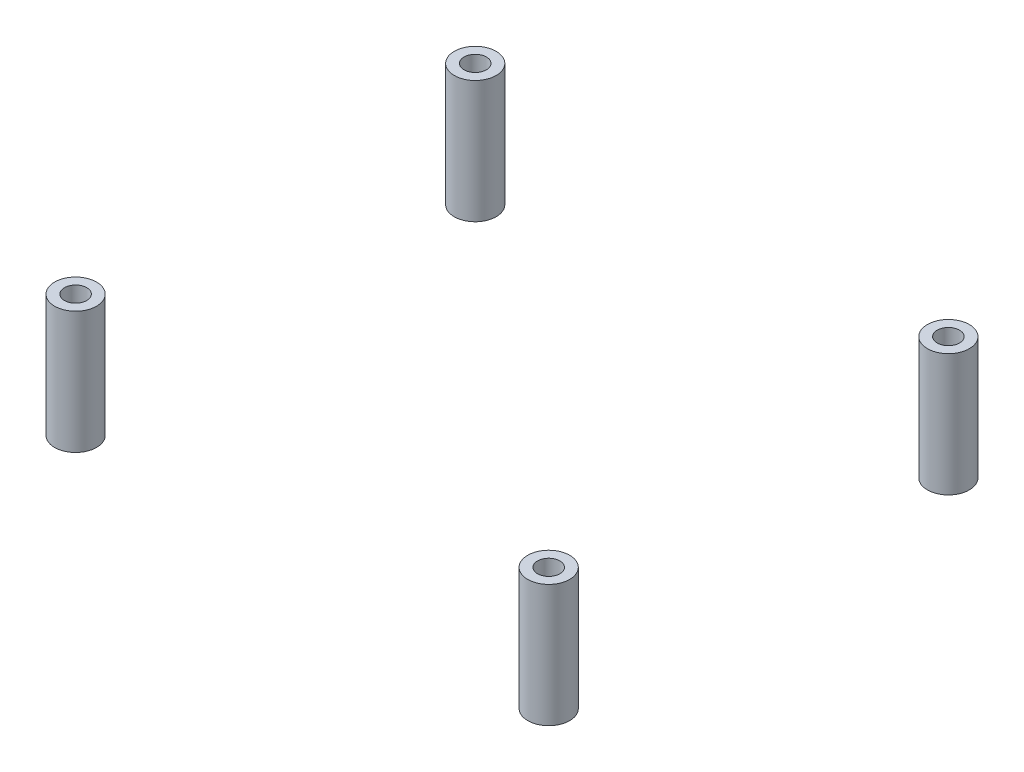
ISO-10303-21;
HEADER;
FILE_DESCRIPTION(('STEP AP214'),'2;1');
FILE_NAME('part.step','',(''),(''),'','','');
FILE_SCHEMA(('AUTOMOTIVE_DESIGN { 1 0 10303 214 1 1 1 1 }'));
ENDSEC;
DATA;
#1=APPLICATION_CONTEXT('core data for automotive mechanical design processes');
#2=APPLICATION_PROTOCOL_DEFINITION('international standard','automotive_design',2000,#1);
#3=PRODUCT_CONTEXT('',#1,'mechanical');
#4=PRODUCT('Part','Part','',(#3));
#5=PRODUCT_RELATED_PRODUCT_CATEGORY('part','',(#4));
#6=PRODUCT_DEFINITION_FORMATION('','',#4);
#7=PRODUCT_DEFINITION_CONTEXT('part definition',#1,'design');
#8=PRODUCT_DEFINITION('design','',#6,#7);
#9=PRODUCT_DEFINITION_SHAPE('','',#8);
#10=(LENGTH_UNIT() NAMED_UNIT(*) SI_UNIT(.MILLI.,.METRE.));
#11=(NAMED_UNIT(*) PLANE_ANGLE_UNIT() SI_UNIT($,.RADIAN.));
#12=(NAMED_UNIT(*) SI_UNIT($,.STERADIAN.) SOLID_ANGLE_UNIT());
#13=UNCERTAINTY_MEASURE_WITH_UNIT(LENGTH_MEASURE(1.E-05),#10,'distance_accuracy_value','');
#14=(GEOMETRIC_REPRESENTATION_CONTEXT(3) GLOBAL_UNCERTAINTY_ASSIGNED_CONTEXT((#13)) GLOBAL_UNIT_ASSIGNED_CONTEXT((#10,
#11,#12)) REPRESENTATION_CONTEXT('',''));
#15=CARTESIAN_POINT('',(0.,0.,0.));
#16=DIRECTION('',(0.,0.,1.));
#17=DIRECTION('',(1.,0.,0.));
#18=AXIS2_PLACEMENT_3D('',#15,#16,#17);
#19=CARTESIAN_POINT('',(128.455,15.,-54.4602623042089));
#20=DIRECTION('',(0.,1.,0.));
#21=DIRECTION('',(0.,0.,1.));
#22=AXIS2_PLACEMENT_3D('',#19,#20,#21);
#23=PLANE('',#22);
#24=CARTESIAN_POINT('',(128.455,15.,-54.4602623042089));
#25=DIRECTION('',(0.,1.,0.));
#26=DIRECTION('',(0.,0.,1.));
#27=AXIS2_PLACEMENT_3D('',#24,#25,#26);
#28=CIRCLE('',#27,2.56818290838057);
#29=CARTESIAN_POINT('',(128.455,15.,-51.8920793958283));
#30=VERTEX_POINT('',#29);
#31=EDGE_CURVE('E11',#30,#30,#28,.T.);
#32=ORIENTED_EDGE('',*,*,#31,.T.);
#33=EDGE_LOOP('',(#32));
#34=FACE_BOUND('',#33,.T.);
#35=CARTESIAN_POINT('',(128.455,15.,-54.4602623042089));
#36=DIRECTION('',(0.,1.,0.));
#37=DIRECTION('',(0.,0.,1.));
#38=AXIS2_PLACEMENT_3D('',#35,#36,#37);
#39=CIRCLE('',#38,1.36818290838055);
#40=CARTESIAN_POINT('',(128.455,15.,-53.0920793958283));
#41=VERTEX_POINT('',#40);
#42=EDGE_CURVE('E51',#41,#41,#39,.T.);
#43=ORIENTED_EDGE('',*,*,#42,.F.);
#44=EDGE_LOOP('',(#43));
#45=FACE_BOUND('',#44,.T.);
#46=ADVANCED_FACE('F40',(#34,#45),#23,.T.);
#47=CARTESIAN_POINT('',(128.455,0.,-54.4602623042089));
#48=DIRECTION('',(0.,1.,0.));
#49=DIRECTION('',(0.,0.,1.));
#50=AXIS2_PLACEMENT_3D('',#47,#48,#49);
#51=PLANE('',#50);
#52=CARTESIAN_POINT('',(128.455,0.,-54.4602623042089));
#53=DIRECTION('',(0.,1.,0.));
#54=DIRECTION('',(0.,0.,1.));
#55=AXIS2_PLACEMENT_3D('',#52,#53,#54);
#56=CIRCLE('',#55,2.56818290838057);
#57=CARTESIAN_POINT('',(128.455,0.,-51.8920793958283));
#58=VERTEX_POINT('',#57);
#59=EDGE_CURVE('E44',#58,#58,#56,.T.);
#60=ORIENTED_EDGE('',*,*,#59,.F.);
#61=EDGE_LOOP('',(#60));
#62=FACE_BOUND('',#61,.T.);
#63=CARTESIAN_POINT('',(128.455,0.,-54.4602623042089));
#64=DIRECTION('',(0.,1.,0.));
#65=DIRECTION('',(0.,0.,1.));
#66=AXIS2_PLACEMENT_3D('',#63,#64,#65);
#67=CIRCLE('',#66,1.36818290838055);
#68=CARTESIAN_POINT('',(128.455,0.,-53.0920793958283));
#69=VERTEX_POINT('',#68);
#70=EDGE_CURVE('E53',#69,#69,#67,.T.);
#71=ORIENTED_EDGE('',*,*,#70,.T.);
#72=EDGE_LOOP('',(#71));
#73=FACE_BOUND('',#72,.T.);
#74=ADVANCED_FACE('F63',(#62,#73),#51,.F.);
#75=CARTESIAN_POINT('',(128.455,15.,-54.4602623042089));
#76=DIRECTION('',(0.,-1.,0.));
#77=DIRECTION('',(0.,0.,-1.));
#78=AXIS2_PLACEMENT_3D('',#75,#76,#77);
#79=CYLINDRICAL_SURFACE('',#78,2.56818290838057);
#80=ORIENTED_EDGE('',*,*,#31,.F.);
#81=EDGE_LOOP('',(#80));
#82=FACE_BOUND('',#81,.T.);
#83=ORIENTED_EDGE('',*,*,#59,.T.);
#84=EDGE_LOOP('',(#83));
#85=FACE_BOUND('',#84,.T.);
#86=ADVANCED_FACE('F42',(#82,#85),#79,.T.);
#87=CARTESIAN_POINT('',(128.455,15.,-54.4602623042089));
#88=DIRECTION('',(0.,-1.,0.));
#89=DIRECTION('',(0.,0.,-1.));
#90=AXIS2_PLACEMENT_3D('',#87,#88,#89);
#91=CYLINDRICAL_SURFACE('',#90,1.36818290838055);
#92=ORIENTED_EDGE('',*,*,#42,.T.);
#93=EDGE_LOOP('',(#92));
#94=FACE_BOUND('',#93,.T.);
#95=ORIENTED_EDGE('',*,*,#70,.F.);
#96=EDGE_LOOP('',(#95));
#97=FACE_BOUND('',#96,.T.);
#98=ADVANCED_FACE('F59',(#94,#97),#91,.F.);
#99=CLOSED_SHELL('',(#46,#74,#86,#98));
#100=MANIFOLD_SOLID_BREP('B2',#99);
#101=CARTESIAN_POINT('',(186.452691974981,15.,-54.4602623042089));
#102=DIRECTION('',(0.,1.,0.));
#103=DIRECTION('',(0.,0.,1.));
#104=AXIS2_PLACEMENT_3D('',#101,#102,#103);
#105=PLANE('',#104);
#106=CARTESIAN_POINT('',(186.452691974981,15.,-54.4602623042089));
#107=DIRECTION('',(0.,1.,0.));
#108=DIRECTION('',(0.,0.,1.));
#109=AXIS2_PLACEMENT_3D('',#106,#107,#108);
#110=CIRCLE('',#109,2.56818290838057);
#111=CARTESIAN_POINT('',(186.452691974981,15.,-51.8920793958283));
#112=VERTEX_POINT('',#111);
#113=EDGE_CURVE('E39',#112,#112,#110,.T.);
#114=ORIENTED_EDGE('',*,*,#113,.T.);
#115=EDGE_LOOP('',(#114));
#116=FACE_BOUND('',#115,.T.);
#117=CARTESIAN_POINT('',(186.452691974981,15.,-54.4602623042089));
#118=DIRECTION('',(0.,1.,0.));
#119=DIRECTION('',(0.,0.,1.));
#120=AXIS2_PLACEMENT_3D('',#117,#118,#119);
#121=CIRCLE('',#120,1.36818290838055);
#122=CARTESIAN_POINT('',(186.452691974981,15.,-53.0920793958283));
#123=VERTEX_POINT('',#122);
#124=EDGE_CURVE('E121',#123,#123,#121,.T.);
#125=ORIENTED_EDGE('',*,*,#124,.F.);
#126=EDGE_LOOP('',(#125));
#127=FACE_BOUND('',#126,.T.);
#128=ADVANCED_FACE('F110',(#116,#127),#105,.T.);
#129=CARTESIAN_POINT('',(186.452691974981,0.,-54.4602623042089));
#130=DIRECTION('',(0.,1.,0.));
#131=DIRECTION('',(0.,0.,1.));
#132=AXIS2_PLACEMENT_3D('',#129,#130,#131);
#133=PLANE('',#132);
#134=CARTESIAN_POINT('',(186.452691974981,0.,-54.4602623042089));
#135=DIRECTION('',(0.,1.,0.));
#136=DIRECTION('',(0.,0.,1.));
#137=AXIS2_PLACEMENT_3D('',#134,#135,#136);
#138=CIRCLE('',#137,2.56818290838057);
#139=CARTESIAN_POINT('',(186.452691974981,0.,-51.8920793958283));
#140=VERTEX_POINT('',#139);
#141=EDGE_CURVE('E114',#140,#140,#138,.T.);
#142=ORIENTED_EDGE('',*,*,#141,.F.);
#143=EDGE_LOOP('',(#142));
#144=FACE_BOUND('',#143,.T.);
#145=CARTESIAN_POINT('',(186.452691974981,0.,-54.4602623042089));
#146=DIRECTION('',(0.,1.,0.));
#147=DIRECTION('',(0.,0.,1.));
#148=AXIS2_PLACEMENT_3D('',#145,#146,#147);
#149=CIRCLE('',#148,1.36818290838055);
#150=CARTESIAN_POINT('',(186.452691974981,0.,-53.0920793958283));
#151=VERTEX_POINT('',#150);
#152=EDGE_CURVE('E123',#151,#151,#149,.T.);
#153=ORIENTED_EDGE('',*,*,#152,.T.);
#154=EDGE_LOOP('',(#153));
#155=FACE_BOUND('',#154,.T.);
#156=ADVANCED_FACE('F133',(#144,#155),#133,.F.);
#157=CARTESIAN_POINT('',(186.452691974981,15.,-54.4602623042089));
#158=DIRECTION('',(0.,-1.,0.));
#159=DIRECTION('',(0.,0.,-1.));
#160=AXIS2_PLACEMENT_3D('',#157,#158,#159);
#161=CYLINDRICAL_SURFACE('',#160,2.56818290838057);
#162=ORIENTED_EDGE('',*,*,#113,.F.);
#163=EDGE_LOOP('',(#162));
#164=FACE_BOUND('',#163,.T.);
#165=ORIENTED_EDGE('',*,*,#141,.T.);
#166=EDGE_LOOP('',(#165));
#167=FACE_BOUND('',#166,.T.);
#168=ADVANCED_FACE('F112',(#164,#167),#161,.T.);
#169=CARTESIAN_POINT('',(186.452691974981,15.,-54.4602623042089));
#170=DIRECTION('',(0.,-1.,0.));
#171=DIRECTION('',(0.,0.,-1.));
#172=AXIS2_PLACEMENT_3D('',#169,#170,#171);
#173=CYLINDRICAL_SURFACE('',#172,1.36818290838055);
#174=ORIENTED_EDGE('',*,*,#124,.T.);
#175=EDGE_LOOP('',(#174));
#176=FACE_BOUND('',#175,.T.);
#177=ORIENTED_EDGE('',*,*,#152,.F.);
#178=EDGE_LOOP('',(#177));
#179=FACE_BOUND('',#178,.T.);
#180=ADVANCED_FACE('F129',(#176,#179),#173,.F.);
#181=CLOSED_SHELL('',(#128,#156,#168,#180));
#182=MANIFOLD_SOLID_BREP('B6',#181);
#183=CARTESIAN_POINT('',(186.452691974981,15.,-5.47));
#184=DIRECTION('',(0.,1.,0.));
#185=DIRECTION('',(0.,0.,1.));
#186=AXIS2_PLACEMENT_3D('',#183,#184,#185);
#187=PLANE('',#186);
#188=CARTESIAN_POINT('',(186.452691974981,15.,-5.47));
#189=DIRECTION('',(0.,1.,0.));
#190=DIRECTION('',(0.,0.,1.));
#191=AXIS2_PLACEMENT_3D('',#188,#189,#190);
#192=CIRCLE('',#191,2.56818290838056);
#193=CARTESIAN_POINT('',(186.452691974981,15.,-2.90181709161944));
#194=VERTEX_POINT('',#193);
#195=EDGE_CURVE('E109',#194,#194,#192,.T.);
#196=ORIENTED_EDGE('',*,*,#195,.T.);
#197=EDGE_LOOP('',(#196));
#198=FACE_BOUND('',#197,.T.);
#199=CARTESIAN_POINT('',(186.452691974981,15.,-5.47));
#200=DIRECTION('',(0.,1.,0.));
#201=DIRECTION('',(0.,0.,1.));
#202=AXIS2_PLACEMENT_3D('',#199,#200,#201);
#203=CIRCLE('',#202,1.36818290838055);
#204=CARTESIAN_POINT('',(186.452691974981,15.,-4.10181709161945));
#205=VERTEX_POINT('',#204);
#206=EDGE_CURVE('E190',#205,#205,#203,.T.);
#207=ORIENTED_EDGE('',*,*,#206,.F.);
#208=EDGE_LOOP('',(#207));
#209=FACE_BOUND('',#208,.T.);
#210=ADVANCED_FACE('F179',(#198,#209),#187,.T.);
#211=CARTESIAN_POINT('',(186.452691974981,0.,-5.47));
#212=DIRECTION('',(0.,1.,0.));
#213=DIRECTION('',(0.,0.,1.));
#214=AXIS2_PLACEMENT_3D('',#211,#212,#213);
#215=PLANE('',#214);
#216=CARTESIAN_POINT('',(186.452691974981,0.,-5.47));
#217=DIRECTION('',(0.,1.,0.));
#218=DIRECTION('',(0.,0.,1.));
#219=AXIS2_PLACEMENT_3D('',#216,#217,#218);
#220=CIRCLE('',#219,2.56818290838056);
#221=CARTESIAN_POINT('',(186.452691974981,0.,-2.90181709161944));
#222=VERTEX_POINT('',#221);
#223=EDGE_CURVE('E183',#222,#222,#220,.T.);
#224=ORIENTED_EDGE('',*,*,#223,.F.);
#225=EDGE_LOOP('',(#224));
#226=FACE_BOUND('',#225,.T.);
#227=CARTESIAN_POINT('',(186.452691974981,0.,-5.47));
#228=DIRECTION('',(0.,1.,0.));
#229=DIRECTION('',(0.,0.,1.));
#230=AXIS2_PLACEMENT_3D('',#227,#228,#229);
#231=CIRCLE('',#230,1.36818290838055);
#232=CARTESIAN_POINT('',(186.452691974981,0.,-4.10181709161945));
#233=VERTEX_POINT('',#232);
#234=EDGE_CURVE('E192',#233,#233,#231,.T.);
#235=ORIENTED_EDGE('',*,*,#234,.T.);
#236=EDGE_LOOP('',(#235));
#237=FACE_BOUND('',#236,.T.);
#238=ADVANCED_FACE('F202',(#226,#237),#215,.F.);
#239=CARTESIAN_POINT('',(186.452691974981,15.,-5.47));
#240=DIRECTION('',(0.,-1.,0.));
#241=DIRECTION('',(0.,0.,-1.));
#242=AXIS2_PLACEMENT_3D('',#239,#240,#241);
#243=CYLINDRICAL_SURFACE('',#242,2.56818290838056);
#244=ORIENTED_EDGE('',*,*,#195,.F.);
#245=EDGE_LOOP('',(#244));
#246=FACE_BOUND('',#245,.T.);
#247=ORIENTED_EDGE('',*,*,#223,.T.);
#248=EDGE_LOOP('',(#247));
#249=FACE_BOUND('',#248,.T.);
#250=ADVANCED_FACE('F181',(#246,#249),#243,.T.);
#251=CARTESIAN_POINT('',(186.452691974981,15.,-5.47));
#252=DIRECTION('',(0.,-1.,0.));
#253=DIRECTION('',(0.,0.,-1.));
#254=AXIS2_PLACEMENT_3D('',#251,#252,#253);
#255=CYLINDRICAL_SURFACE('',#254,1.36818290838055);
#256=ORIENTED_EDGE('',*,*,#206,.T.);
#257=EDGE_LOOP('',(#256));
#258=FACE_BOUND('',#257,.T.);
#259=ORIENTED_EDGE('',*,*,#234,.F.);
#260=EDGE_LOOP('',(#259));
#261=FACE_BOUND('',#260,.T.);
#262=ADVANCED_FACE('F198',(#258,#261),#255,.F.);
#263=CLOSED_SHELL('',(#210,#238,#250,#262));
#264=MANIFOLD_SOLID_BREP('B34',#263);
#265=CARTESIAN_POINT('',(128.455237248486,15.,-5.47681296212571));
#266=DIRECTION('',(0.,1.,0.));
#267=DIRECTION('',(0.,0.,1.));
#268=AXIS2_PLACEMENT_3D('',#265,#266,#267);
#269=PLANE('',#268);
#270=CARTESIAN_POINT('',(128.455237248486,15.,-5.47681296212571));
#271=DIRECTION('',(0.,1.,0.));
#272=DIRECTION('',(0.,0.,1.));
#273=AXIS2_PLACEMENT_3D('',#270,#271,#272);
#274=CIRCLE('',#273,2.56818290835362);
#275=CARTESIAN_POINT('',(128.455237248486,15.,-2.90863005377208));
#276=VERTEX_POINT('',#275);
#277=EDGE_CURVE('E178',#276,#276,#274,.T.);
#278=ORIENTED_EDGE('',*,*,#277,.T.);
#279=EDGE_LOOP('',(#278));
#280=FACE_BOUND('',#279,.T.);
#281=CARTESIAN_POINT('',(128.455237248486,15.,-5.47681296212571));
#282=DIRECTION('',(0.,1.,0.));
#283=DIRECTION('',(0.,0.,1.));
#284=AXIS2_PLACEMENT_3D('',#281,#282,#283);
#285=CIRCLE('',#284,1.36818290835361);
#286=CARTESIAN_POINT('',(128.455237248486,15.,-4.1086300537721));
#287=VERTEX_POINT('',#286);
#288=EDGE_CURVE('E252',#287,#287,#285,.T.);
#289=ORIENTED_EDGE('',*,*,#288,.F.);
#290=EDGE_LOOP('',(#289));
#291=FACE_BOUND('',#290,.T.);
#292=ADVANCED_FACE('F241',(#280,#291),#269,.T.);
#293=CARTESIAN_POINT('',(128.455237248486,0.,-5.47681296212571));
#294=DIRECTION('',(0.,1.,0.));
#295=DIRECTION('',(0.,0.,1.));
#296=AXIS2_PLACEMENT_3D('',#293,#294,#295);
#297=PLANE('',#296);
#298=CARTESIAN_POINT('',(128.455237248486,0.,-5.47681296212571));
#299=DIRECTION('',(0.,1.,0.));
#300=DIRECTION('',(0.,0.,1.));
#301=AXIS2_PLACEMENT_3D('',#298,#299,#300);
#302=CIRCLE('',#301,2.56818290835362);
#303=CARTESIAN_POINT('',(128.455237248486,0.,-2.90863005377208));
#304=VERTEX_POINT('',#303);
#305=EDGE_CURVE('E245',#304,#304,#302,.T.);
#306=ORIENTED_EDGE('',*,*,#305,.F.);
#307=EDGE_LOOP('',(#306));
#308=FACE_BOUND('',#307,.T.);
#309=CARTESIAN_POINT('',(128.455237248486,0.,-5.47681296212571));
#310=DIRECTION('',(0.,1.,0.));
#311=DIRECTION('',(0.,0.,1.));
#312=AXIS2_PLACEMENT_3D('',#309,#310,#311);
#313=CIRCLE('',#312,1.36818290835361);
#314=CARTESIAN_POINT('',(128.455237248486,0.,-4.1086300537721));
#315=VERTEX_POINT('',#314);
#316=EDGE_CURVE('E254',#315,#315,#313,.T.);
#317=ORIENTED_EDGE('',*,*,#316,.T.);
#318=EDGE_LOOP('',(#317));
#319=FACE_BOUND('',#318,.T.);
#320=ADVANCED_FACE('F264',(#308,#319),#297,.F.);
#321=CARTESIAN_POINT('',(128.455237248486,15.,-5.47681296212571));
#322=DIRECTION('',(0.,-1.,0.));
#323=DIRECTION('',(0.,0.,-1.));
#324=AXIS2_PLACEMENT_3D('',#321,#322,#323);
#325=CYLINDRICAL_SURFACE('',#324,2.56818290835362);
#326=ORIENTED_EDGE('',*,*,#277,.F.);
#327=EDGE_LOOP('',(#326));
#328=FACE_BOUND('',#327,.T.);
#329=ORIENTED_EDGE('',*,*,#305,.T.);
#330=EDGE_LOOP('',(#329));
#331=FACE_BOUND('',#330,.T.);
#332=ADVANCED_FACE('F243',(#328,#331),#325,.T.);
#333=CARTESIAN_POINT('',(128.455237248486,15.,-5.47681296212571));
#334=DIRECTION('',(0.,-1.,0.));
#335=DIRECTION('',(0.,0.,-1.));
#336=AXIS2_PLACEMENT_3D('',#333,#334,#335);
#337=CYLINDRICAL_SURFACE('',#336,1.36818290835361);
#338=ORIENTED_EDGE('',*,*,#288,.T.);
#339=EDGE_LOOP('',(#338));
#340=FACE_BOUND('',#339,.T.);
#341=ORIENTED_EDGE('',*,*,#316,.F.);
#342=EDGE_LOOP('',(#341));
#343=FACE_BOUND('',#342,.T.);
#344=ADVANCED_FACE('F260',(#340,#343),#337,.F.);
#345=CLOSED_SHELL('',(#292,#320,#332,#344));
#346=MANIFOLD_SOLID_BREP('B104',#345);
#347=ADVANCED_BREP_SHAPE_REPRESENTATION('',(#18,#100,#182,#264,#346),#14);
#348=SHAPE_DEFINITION_REPRESENTATION(#9,#347);
ENDSEC;
END-ISO-10303-21;
